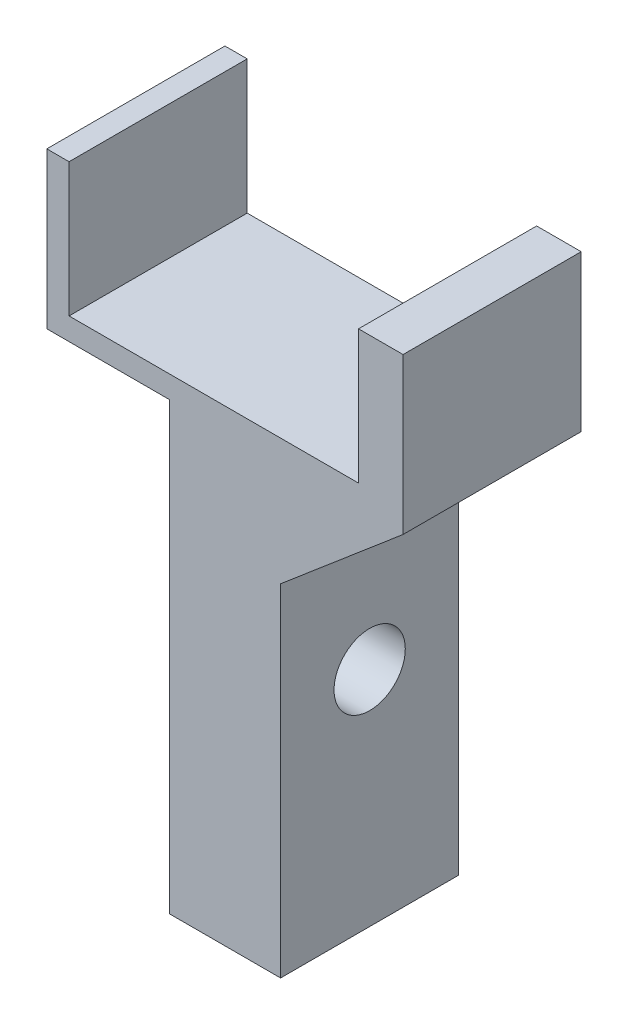
ISO-10303-21;
HEADER;
FILE_DESCRIPTION(('STEP AP214'),'2;1');
FILE_NAME('part.step','',(''),(''),'','','');
FILE_SCHEMA(('AUTOMOTIVE_DESIGN { 1 0 10303 214 1 1 1 1 }'));
ENDSEC;
DATA;
#1=APPLICATION_CONTEXT('core data for automotive mechanical design processes');
#2=APPLICATION_PROTOCOL_DEFINITION('international standard','automotive_design',2000,#1);
#3=PRODUCT_CONTEXT('',#1,'mechanical');
#4=PRODUCT('Part','Part','',(#3));
#5=PRODUCT_RELATED_PRODUCT_CATEGORY('part','',(#4));
#6=PRODUCT_DEFINITION_FORMATION('','',#4);
#7=PRODUCT_DEFINITION_CONTEXT('part definition',#1,'design');
#8=PRODUCT_DEFINITION('design','',#6,#7);
#9=PRODUCT_DEFINITION_SHAPE('','',#8);
#10=(LENGTH_UNIT() NAMED_UNIT(*) SI_UNIT(.MILLI.,.METRE.));
#11=(NAMED_UNIT(*) PLANE_ANGLE_UNIT() SI_UNIT($,.RADIAN.));
#12=(NAMED_UNIT(*) SI_UNIT($,.STERADIAN.) SOLID_ANGLE_UNIT());
#13=UNCERTAINTY_MEASURE_WITH_UNIT(LENGTH_MEASURE(1.E-05),#10,'distance_accuracy_value','');
#14=(GEOMETRIC_REPRESENTATION_CONTEXT(3) GLOBAL_UNCERTAINTY_ASSIGNED_CONTEXT((#13)) GLOBAL_UNIT_ASSIGNED_CONTEXT((#10,
#11,#12)) REPRESENTATION_CONTEXT('',''));
#15=CARTESIAN_POINT('',(0.,0.,0.));
#16=DIRECTION('',(0.,0.,1.));
#17=DIRECTION('',(1.,0.,0.));
#18=AXIS2_PLACEMENT_3D('',#15,#16,#17);
#19=CARTESIAN_POINT('',(5.5,27.,8.));
#20=DIRECTION('',(0.,-1.,0.));
#21=DIRECTION('',(1.,0.,0.));
#22=AXIS2_PLACEMENT_3D('',#19,#20,#21);
#23=PLANE('',#22);
#24=DIRECTION('',(-1.,0.,0.));
#25=VECTOR('',#24,1.);
#26=CARTESIAN_POINT('',(5.5,27.,0.));
#27=LINE('',#26,#25);
#28=CARTESIAN_POINT('',(5.5,27.,0.));
#29=VERTEX_POINT('',#28);
#30=CARTESIAN_POINT('',(3.5,27.,0.));
#31=VERTEX_POINT('',#30);
#32=EDGE_CURVE('E155',#29,#31,#27,.T.);
#33=ORIENTED_EDGE('',*,*,#32,.T.);
#34=DIRECTION('',(0.,0.,1.));
#35=VECTOR('',#34,1.);
#36=CARTESIAN_POINT('',(3.5,27.,8.));
#37=LINE('',#36,#35);
#38=CARTESIAN_POINT('',(3.5,27.,8.));
#39=VERTEX_POINT('',#38);
#40=EDGE_CURVE('E150',#31,#39,#37,.T.);
#41=ORIENTED_EDGE('',*,*,#40,.T.);
#42=DIRECTION('',(-1.,0.,0.));
#43=VECTOR('',#42,1.);
#44=CARTESIAN_POINT('',(5.5,27.,8.));
#45=LINE('',#44,#43);
#46=CARTESIAN_POINT('',(5.5,27.,8.));
#47=VERTEX_POINT('',#46);
#48=EDGE_CURVE('E196',#47,#39,#45,.T.);
#49=ORIENTED_EDGE('',*,*,#48,.F.);
#50=DIRECTION('',(0.,0.,-1.));
#51=VECTOR('',#50,1.);
#52=CARTESIAN_POINT('',(5.5,27.,8.));
#53=LINE('',#52,#51);
#54=EDGE_CURVE('E171',#47,#29,#53,.T.);
#55=ORIENTED_EDGE('',*,*,#54,.T.);
#56=EDGE_LOOP('',(#33,#41,#49,#55));
#57=FACE_BOUND('',#56,.T.);
#58=ADVANCED_FACE('F35',(#57),#23,.F.);
#59=CARTESIAN_POINT('',(0.,0.,8.));
#60=DIRECTION('',(-1.,0.,0.));
#61=DIRECTION('',(0.,0.,1.));
#62=AXIS2_PLACEMENT_3D('',#59,#60,#61);
#63=PLANE('',#62);
#64=CARTESIAN_POINT('',(0.,10.,4.));
#65=DIRECTION('',(1.,0.,0.));
#66=DIRECTION('',(0.,0.,-1.));
#67=AXIS2_PLACEMENT_3D('',#64,#65,#66);
#68=CIRCLE('',#67,1.6);
#69=CARTESIAN_POINT('',(0.,10.,2.4));
#70=VERTEX_POINT('',#69);
#71=EDGE_CURVE('E226',#70,#70,#68,.T.);
#72=ORIENTED_EDGE('',*,*,#71,.F.);
#73=EDGE_LOOP('',(#72));
#74=FACE_BOUND('',#73,.T.);
#75=DIRECTION('',(0.,1.,0.));
#76=VECTOR('',#75,1.);
#77=CARTESIAN_POINT('',(0.,0.,0.));
#78=LINE('',#77,#76);
#79=CARTESIAN_POINT('',(0.,0.,0.));
#80=VERTEX_POINT('',#79);
#81=CARTESIAN_POINT('',(0.,15.3335945399065,0.));
#82=VERTEX_POINT('',#81);
#83=EDGE_CURVE('E146',#80,#82,#78,.T.);
#84=ORIENTED_EDGE('',*,*,#83,.T.);
#85=DIRECTION('',(0.,0.,-1.));
#86=VECTOR('',#85,1.);
#87=CARTESIAN_POINT('',(0.,15.3335945399065,8.));
#88=LINE('',#87,#86);
#89=CARTESIAN_POINT('',(0.,15.3335945399065,8.));
#90=VERTEX_POINT('',#89);
#91=EDGE_CURVE('E44',#90,#82,#88,.T.);
#92=ORIENTED_EDGE('',*,*,#91,.F.);
#93=DIRECTION('',(0.,1.,0.));
#94=VECTOR('',#93,1.);
#95=CARTESIAN_POINT('',(0.,0.,8.));
#96=LINE('',#95,#94);
#97=CARTESIAN_POINT('',(0.,0.,8.));
#98=VERTEX_POINT('',#97);
#99=EDGE_CURVE('E164',#98,#90,#96,.T.);
#100=ORIENTED_EDGE('',*,*,#99,.F.);
#101=DIRECTION('',(0.,0.,-1.));
#102=VECTOR('',#101,1.);
#103=CARTESIAN_POINT('',(0.,0.,8.));
#104=LINE('',#103,#102);
#105=EDGE_CURVE('E142',#98,#80,#104,.T.);
#106=ORIENTED_EDGE('',*,*,#105,.T.);
#107=EDGE_LOOP('',(#84,#92,#100,#106));
#108=FACE_BOUND('',#107,.T.);
#109=ADVANCED_FACE('F37',(#74,#108),#63,.F.);
#110=CARTESIAN_POINT('',(5.5,20.,8.));
#111=DIRECTION('',(-0.646956392391137,0.762527000403425,0.));
#112=DIRECTION('',(-0.762527000403426,-0.646956392391137,0.));
#113=AXIS2_PLACEMENT_3D('',#110,#111,#112);
#114=PLANE('',#113);
#115=DIRECTION('',(0.762527000403425,0.646956392391137,0.));
#116=VECTOR('',#115,1.);
#117=CARTESIAN_POINT('',(5.5,20.,0.));
#118=LINE('',#117,#116);
#119=CARTESIAN_POINT('',(5.5,20.,0.));
#120=VERTEX_POINT('',#119);
#121=EDGE_CURVE('E149',#82,#120,#118,.T.);
#122=ORIENTED_EDGE('',*,*,#121,.T.);
#123=DIRECTION('',(0.,0.,-1.));
#124=VECTOR('',#123,1.);
#125=CARTESIAN_POINT('',(5.5,20.,8.));
#126=LINE('',#125,#124);
#127=CARTESIAN_POINT('',(5.5,20.,8.));
#128=VERTEX_POINT('',#127);
#129=EDGE_CURVE('E174',#128,#120,#126,.T.);
#130=ORIENTED_EDGE('',*,*,#129,.F.);
#131=DIRECTION('',(0.762527000403425,0.646956392391137,0.));
#132=VECTOR('',#131,1.);
#133=CARTESIAN_POINT('',(5.5,20.,8.));
#134=LINE('',#133,#132);
#135=EDGE_CURVE('E102',#90,#128,#134,.T.);
#136=ORIENTED_EDGE('',*,*,#135,.F.);
#137=ORIENTED_EDGE('',*,*,#91,.T.);
#138=EDGE_LOOP('',(#122,#130,#136,#137));
#139=FACE_BOUND('',#138,.T.);
#140=ADVANCED_FACE('F178',(#139),#114,.F.);
#141=CARTESIAN_POINT('',(5.5,27.,8.));
#142=DIRECTION('',(-1.,0.,0.));
#143=DIRECTION('',(0.,-1.,0.));
#144=AXIS2_PLACEMENT_3D('',#141,#142,#143);
#145=PLANE('',#144);
#146=DIRECTION('',(0.,1.,0.));
#147=VECTOR('',#146,1.);
#148=CARTESIAN_POINT('',(5.5,27.,0.));
#149=LINE('',#148,#147);
#150=EDGE_CURVE('E152',#120,#29,#149,.T.);
#151=ORIENTED_EDGE('',*,*,#150,.T.);
#152=ORIENTED_EDGE('',*,*,#54,.F.);
#153=DIRECTION('',(0.,1.,0.));
#154=VECTOR('',#153,1.);
#155=CARTESIAN_POINT('',(5.5,27.,8.));
#156=LINE('',#155,#154);
#157=EDGE_CURVE('E200',#128,#47,#156,.T.);
#158=ORIENTED_EDGE('',*,*,#157,.F.);
#159=ORIENTED_EDGE('',*,*,#129,.T.);
#160=EDGE_LOOP('',(#151,#152,#158,#159));
#161=FACE_BOUND('',#160,.T.);
#162=ADVANCED_FACE('F189',(#161),#145,.F.);
#163=CARTESIAN_POINT('',(-9.5,27.,8.));
#164=VERTEX_POINT('',#163);
#165=CARTESIAN_POINT('',(-10.5,27.,8.));
#166=VERTEX_POINT('',#165);
#167=EDGE_CURVE('E198',#164,#166,#45,.T.);
#168=ORIENTED_EDGE('',*,*,#167,.F.);
#169=DIRECTION('',(0.,0.,-1.));
#170=VECTOR('',#169,1.);
#171=CARTESIAN_POINT('',(-9.5,27.,8.));
#172=LINE('',#171,#170);
#173=CARTESIAN_POINT('',(-9.5,27.,0.));
#174=VERTEX_POINT('',#173);
#175=EDGE_CURVE('E206',#164,#174,#172,.T.);
#176=ORIENTED_EDGE('',*,*,#175,.T.);
#177=CARTESIAN_POINT('',(-10.5,27.,0.));
#178=VERTEX_POINT('',#177);
#179=EDGE_CURVE('E154',#174,#178,#27,.T.);
#180=ORIENTED_EDGE('',*,*,#179,.T.);
#181=DIRECTION('',(0.,0.,-1.));
#182=VECTOR('',#181,1.);
#183=CARTESIAN_POINT('',(-10.5,27.,8.));
#184=LINE('',#183,#182);
#185=EDGE_CURVE('E168',#166,#178,#184,.T.);
#186=ORIENTED_EDGE('',*,*,#185,.F.);
#187=EDGE_LOOP('',(#168,#176,#180,#186));
#188=FACE_BOUND('',#187,.T.);
#189=ADVANCED_FACE('F246',(#188),#23,.F.);
#190=CARTESIAN_POINT('',(-10.5,27.,8.));
#191=DIRECTION('',(1.,0.,0.));
#192=DIRECTION('',(0.,0.,-1.));
#193=AXIS2_PLACEMENT_3D('',#190,#191,#192);
#194=PLANE('',#193);
#195=DIRECTION('',(0.,-1.,0.));
#196=VECTOR('',#195,1.);
#197=CARTESIAN_POINT('',(-10.5,27.,0.));
#198=LINE('',#197,#196);
#199=CARTESIAN_POINT('',(-10.5,20.,0.));
#200=VERTEX_POINT('',#199);
#201=EDGE_CURVE('E158',#178,#200,#198,.T.);
#202=ORIENTED_EDGE('',*,*,#201,.T.);
#203=DIRECTION('',(0.,0.,-1.));
#204=VECTOR('',#203,1.);
#205=CARTESIAN_POINT('',(-10.5,20.,8.));
#206=LINE('',#205,#204);
#207=CARTESIAN_POINT('',(-10.5,20.,8.));
#208=VERTEX_POINT('',#207);
#209=EDGE_CURVE('E137',#208,#200,#206,.T.);
#210=ORIENTED_EDGE('',*,*,#209,.F.);
#211=DIRECTION('',(0.,-1.,0.));
#212=VECTOR('',#211,1.);
#213=CARTESIAN_POINT('',(-10.5,27.,8.));
#214=LINE('',#213,#212);
#215=EDGE_CURVE('E125',#166,#208,#214,.T.);
#216=ORIENTED_EDGE('',*,*,#215,.F.);
#217=ORIENTED_EDGE('',*,*,#185,.T.);
#218=EDGE_LOOP('',(#202,#210,#216,#217));
#219=FACE_BOUND('',#218,.T.);
#220=ADVANCED_FACE('F254',(#219),#194,.F.);
#221=CARTESIAN_POINT('',(-5.,20.,8.));
#222=DIRECTION('',(0.,1.,0.));
#223=DIRECTION('',(0.,0.,1.));
#224=AXIS2_PLACEMENT_3D('',#221,#222,#223);
#225=PLANE('',#224);
#226=DIRECTION('',(1.,0.,0.));
#227=VECTOR('',#226,1.);
#228=CARTESIAN_POINT('',(-5.,20.,0.));
#229=LINE('',#228,#227);
#230=CARTESIAN_POINT('',(-5.,20.,0.));
#231=VERTEX_POINT('',#230);
#232=EDGE_CURVE('E134',#200,#231,#229,.T.);
#233=ORIENTED_EDGE('',*,*,#232,.T.);
#234=DIRECTION('',(0.,0.,-1.));
#235=VECTOR('',#234,1.);
#236=CARTESIAN_POINT('',(-5.,20.,8.));
#237=LINE('',#236,#235);
#238=CARTESIAN_POINT('',(-5.,20.,8.));
#239=VERTEX_POINT('',#238);
#240=EDGE_CURVE('E131',#239,#231,#237,.T.);
#241=ORIENTED_EDGE('',*,*,#240,.F.);
#242=DIRECTION('',(1.,0.,0.));
#243=VECTOR('',#242,1.);
#244=CARTESIAN_POINT('',(-5.,20.,8.));
#245=LINE('',#244,#243);
#246=EDGE_CURVE('E117',#208,#239,#245,.T.);
#247=ORIENTED_EDGE('',*,*,#246,.F.);
#248=ORIENTED_EDGE('',*,*,#209,.T.);
#249=EDGE_LOOP('',(#233,#241,#247,#248));
#250=FACE_BOUND('',#249,.T.);
#251=ADVANCED_FACE('F132',(#250),#225,.F.);
#252=CARTESIAN_POINT('',(-5.,0.,8.));
#253=DIRECTION('',(1.,0.,0.));
#254=DIRECTION('',(0.,0.,-1.));
#255=AXIS2_PLACEMENT_3D('',#252,#253,#254);
#256=PLANE('',#255);
#257=CARTESIAN_POINT('',(-5.,10.,4.));
#258=DIRECTION('',(1.,0.,0.));
#259=DIRECTION('',(0.,0.,-1.));
#260=AXIS2_PLACEMENT_3D('',#257,#258,#259);
#261=CIRCLE('',#260,1.6);
#262=CARTESIAN_POINT('',(-5.,10.,2.4));
#263=VERTEX_POINT('',#262);
#264=EDGE_CURVE('E39',#263,#263,#261,.T.);
#265=ORIENTED_EDGE('',*,*,#264,.T.);
#266=EDGE_LOOP('',(#265));
#267=FACE_BOUND('',#266,.T.);
#268=DIRECTION('',(0.,-1.,0.));
#269=VECTOR('',#268,1.);
#270=CARTESIAN_POINT('',(-5.,0.,0.));
#271=LINE('',#270,#269);
#272=CARTESIAN_POINT('',(-5.,0.,0.));
#273=VERTEX_POINT('',#272);
#274=EDGE_CURVE('E161',#231,#273,#271,.T.);
#275=ORIENTED_EDGE('',*,*,#274,.T.);
#276=DIRECTION('',(0.,0.,-1.));
#277=VECTOR('',#276,1.);
#278=CARTESIAN_POINT('',(-5.,0.,8.));
#279=LINE('',#278,#277);
#280=CARTESIAN_POINT('',(-5.,0.,8.));
#281=VERTEX_POINT('',#280);
#282=EDGE_CURVE('E138',#281,#273,#279,.T.);
#283=ORIENTED_EDGE('',*,*,#282,.F.);
#284=DIRECTION('',(0.,-1.,0.));
#285=VECTOR('',#284,1.);
#286=CARTESIAN_POINT('',(-5.,0.,8.));
#287=LINE('',#286,#285);
#288=EDGE_CURVE('E122',#239,#281,#287,.T.);
#289=ORIENTED_EDGE('',*,*,#288,.F.);
#290=ORIENTED_EDGE('',*,*,#240,.T.);
#291=EDGE_LOOP('',(#275,#283,#289,#290));
#292=FACE_BOUND('',#291,.T.);
#293=ADVANCED_FACE('F140',(#267,#292),#256,.F.);
#294=CARTESIAN_POINT('',(0.,0.,8.));
#295=DIRECTION('',(0.,1.,0.));
#296=DIRECTION('',(0.,0.,1.));
#297=AXIS2_PLACEMENT_3D('',#294,#295,#296);
#298=PLANE('',#297);
#299=DIRECTION('',(1.,0.,0.));
#300=VECTOR('',#299,1.);
#301=CARTESIAN_POINT('',(0.,0.,0.));
#302=LINE('',#301,#300);
#303=EDGE_CURVE('E93',#273,#80,#302,.T.);
#304=ORIENTED_EDGE('',*,*,#303,.T.);
#305=ORIENTED_EDGE('',*,*,#105,.F.);
#306=DIRECTION('',(1.,0.,0.));
#307=VECTOR('',#306,1.);
#308=CARTESIAN_POINT('',(0.,0.,8.));
#309=LINE('',#308,#307);
#310=EDGE_CURVE('E60',#281,#98,#309,.T.);
#311=ORIENTED_EDGE('',*,*,#310,.F.);
#312=ORIENTED_EDGE('',*,*,#282,.T.);
#313=EDGE_LOOP('',(#304,#305,#311,#312));
#314=FACE_BOUND('',#313,.T.);
#315=ADVANCED_FACE('F283',(#314),#298,.F.);
#316=CARTESIAN_POINT('',(0.,0.,8.));
#317=DIRECTION('',(0.,0.,1.));
#318=DIRECTION('',(1.,0.,0.));
#319=AXIS2_PLACEMENT_3D('',#316,#317,#318);
#320=PLANE('',#319);
#321=DIRECTION('',(0.,-1.,0.));
#322=VECTOR('',#321,1.);
#323=CARTESIAN_POINT('',(3.5,27.4991061658523,8.));
#324=LINE('',#323,#322);
#325=CARTESIAN_POINT('',(3.5,21.,8.));
#326=VERTEX_POINT('',#325);
#327=EDGE_CURVE('E217',#39,#326,#324,.T.);
#328=ORIENTED_EDGE('',*,*,#327,.T.);
#329=DIRECTION('',(-1.,0.,0.));
#330=VECTOR('',#329,1.);
#331=CARTESIAN_POINT('',(3.5,21.,8.));
#332=LINE('',#331,#330);
#333=CARTESIAN_POINT('',(-9.5,21.,8.));
#334=VERTEX_POINT('',#333);
#335=EDGE_CURVE('E222',#326,#334,#332,.T.);
#336=ORIENTED_EDGE('',*,*,#335,.T.);
#337=DIRECTION('',(0.,1.,0.));
#338=VECTOR('',#337,1.);
#339=CARTESIAN_POINT('',(-9.5,27.4991061658523,8.));
#340=LINE('',#339,#338);
#341=EDGE_CURVE('E211',#334,#164,#340,.T.);
#342=ORIENTED_EDGE('',*,*,#341,.T.);
#343=ORIENTED_EDGE('',*,*,#167,.T.);
#344=ORIENTED_EDGE('',*,*,#215,.T.);
#345=ORIENTED_EDGE('',*,*,#246,.T.);
#346=ORIENTED_EDGE('',*,*,#288,.T.);
#347=ORIENTED_EDGE('',*,*,#310,.T.);
#348=ORIENTED_EDGE('',*,*,#99,.T.);
#349=ORIENTED_EDGE('',*,*,#135,.T.);
#350=ORIENTED_EDGE('',*,*,#157,.T.);
#351=ORIENTED_EDGE('',*,*,#48,.T.);
#352=EDGE_LOOP('',(#328,#336,#342,#343,#344,#345,#346,#347,#348,#349,#350,#351));
#353=FACE_BOUND('',#352,.T.);
#354=ADVANCED_FACE('F120',(#353),#320,.T.);
#355=CARTESIAN_POINT('',(0.,0.,0.));
#356=DIRECTION('',(0.,0.,1.));
#357=DIRECTION('',(1.,0.,0.));
#358=AXIS2_PLACEMENT_3D('',#355,#356,#357);
#359=PLANE('',#358);
#360=DIRECTION('',(-1.,0.,0.));
#361=VECTOR('',#360,1.);
#362=CARTESIAN_POINT('',(3.5,21.,0.));
#363=LINE('',#362,#361);
#364=CARTESIAN_POINT('',(3.5,21.,0.));
#365=VERTEX_POINT('',#364);
#366=CARTESIAN_POINT('',(-9.5,21.,0.));
#367=VERTEX_POINT('',#366);
#368=EDGE_CURVE('E218',#365,#367,#363,.T.);
#369=ORIENTED_EDGE('',*,*,#368,.F.);
#370=DIRECTION('',(0.,1.,0.));
#371=VECTOR('',#370,1.);
#372=CARTESIAN_POINT('',(3.5,0.,0.));
#373=LINE('',#372,#371);
#374=EDGE_CURVE('E11',#365,#31,#373,.T.);
#375=ORIENTED_EDGE('',*,*,#374,.T.);
#376=ORIENTED_EDGE('',*,*,#32,.F.);
#377=ORIENTED_EDGE('',*,*,#150,.F.);
#378=ORIENTED_EDGE('',*,*,#121,.F.);
#379=ORIENTED_EDGE('',*,*,#83,.F.);
#380=ORIENTED_EDGE('',*,*,#303,.F.);
#381=ORIENTED_EDGE('',*,*,#274,.F.);
#382=ORIENTED_EDGE('',*,*,#232,.F.);
#383=ORIENTED_EDGE('',*,*,#201,.F.);
#384=ORIENTED_EDGE('',*,*,#179,.F.);
#385=DIRECTION('',(0.,1.,0.));
#386=VECTOR('',#385,1.);
#387=CARTESIAN_POINT('',(-9.5,27.4991061658523,0.));
#388=LINE('',#387,#386);
#389=EDGE_CURVE('E214',#367,#174,#388,.T.);
#390=ORIENTED_EDGE('',*,*,#389,.F.);
#391=EDGE_LOOP('',(#369,#375,#376,#377,#378,#379,#380,#381,#382,#383,#384,#390));
#392=FACE_BOUND('',#391,.T.);
#393=ADVANCED_FACE('F184',(#392),#359,.F.);
#394=CARTESIAN_POINT('',(3.5,27.4991061658523,8.));
#395=DIRECTION('',(1.,0.,0.));
#396=DIRECTION('',(0.,1.,0.));
#397=AXIS2_PLACEMENT_3D('',#394,#395,#396);
#398=PLANE('',#397);
#399=ORIENTED_EDGE('',*,*,#374,.F.);
#400=DIRECTION('',(0.,0.,-1.));
#401=VECTOR('',#400,1.);
#402=CARTESIAN_POINT('',(3.5,21.,8.));
#403=LINE('',#402,#401);
#404=EDGE_CURVE('E51',#326,#365,#403,.T.);
#405=ORIENTED_EDGE('',*,*,#404,.F.);
#406=ORIENTED_EDGE('',*,*,#327,.F.);
#407=ORIENTED_EDGE('',*,*,#40,.F.);
#408=EDGE_LOOP('',(#399,#405,#406,#407));
#409=FACE_BOUND('',#408,.T.);
#410=ADVANCED_FACE('F280',(#409),#398,.F.);
#411=CARTESIAN_POINT('',(-9.5,27.4991061658523,8.));
#412=DIRECTION('',(-1.,0.,0.));
#413=DIRECTION('',(0.,0.,1.));
#414=AXIS2_PLACEMENT_3D('',#411,#412,#413);
#415=PLANE('',#414);
#416=ORIENTED_EDGE('',*,*,#341,.F.);
#417=DIRECTION('',(0.,0.,-1.));
#418=VECTOR('',#417,1.);
#419=CARTESIAN_POINT('',(-9.5,21.,8.));
#420=LINE('',#419,#418);
#421=EDGE_CURVE('E209',#334,#367,#420,.T.);
#422=ORIENTED_EDGE('',*,*,#421,.T.);
#423=ORIENTED_EDGE('',*,*,#389,.T.);
#424=ORIENTED_EDGE('',*,*,#175,.F.);
#425=EDGE_LOOP('',(#416,#422,#423,#424));
#426=FACE_BOUND('',#425,.T.);
#427=ADVANCED_FACE('F241',(#426),#415,.F.);
#428=CARTESIAN_POINT('',(3.5,21.,8.));
#429=DIRECTION('',(0.,-1.,0.));
#430=DIRECTION('',(0.,0.,-1.));
#431=AXIS2_PLACEMENT_3D('',#428,#429,#430);
#432=PLANE('',#431);
#433=ORIENTED_EDGE('',*,*,#368,.T.);
#434=ORIENTED_EDGE('',*,*,#421,.F.);
#435=ORIENTED_EDGE('',*,*,#335,.F.);
#436=ORIENTED_EDGE('',*,*,#404,.T.);
#437=EDGE_LOOP('',(#433,#434,#435,#436));
#438=FACE_BOUND('',#437,.T.);
#439=ADVANCED_FACE('F236',(#438),#432,.F.);
#440=CARTESIAN_POINT('',(-10.5,10.,4.));
#441=DIRECTION('',(1.,0.,0.));
#442=DIRECTION('',(0.,0.,-1.));
#443=AXIS2_PLACEMENT_3D('',#440,#441,#442);
#444=CYLINDRICAL_SURFACE('',#443,1.6);
#445=CARTESIAN_POINT('',(0.,10.,2.4));
#446=CARTESIAN_POINT('',(-0.0520833333333334,10.,2.4));
#447=CARTESIAN_POINT('',(-0.104166666666667,10.,2.4));
#448=CARTESIAN_POINT('',(-0.208333333333334,10.,2.4));
#449=CARTESIAN_POINT('',(-0.260416666666667,10.,2.4));
#450=CARTESIAN_POINT('',(-0.364583333333334,10.,2.4));
#451=CARTESIAN_POINT('',(-0.416666666666667,10.,2.4));
#452=CARTESIAN_POINT('',(-0.520833333333334,10.,2.4));
#453=CARTESIAN_POINT('',(-0.572916666666667,10.,2.4));
#454=CARTESIAN_POINT('',(-0.677083333333334,10.,2.4));
#455=CARTESIAN_POINT('',(-0.729166666666667,10.,2.4));
#456=CARTESIAN_POINT('',(-0.833333333333334,10.,2.4));
#457=CARTESIAN_POINT('',(-0.885416666666668,10.,2.4));
#458=CARTESIAN_POINT('',(-0.989583333333334,10.,2.4));
#459=CARTESIAN_POINT('',(-1.04166666666667,10.,2.4));
#460=CARTESIAN_POINT('',(-1.14583333333333,10.,2.4));
#461=CARTESIAN_POINT('',(-1.19791666666667,10.,2.4));
#462=CARTESIAN_POINT('',(-1.30208333333333,10.,2.4));
#463=CARTESIAN_POINT('',(-1.35416666666667,10.,2.4));
#464=CARTESIAN_POINT('',(-1.45833333333333,10.,2.4));
#465=CARTESIAN_POINT('',(-1.51041666666667,10.,2.4));
#466=CARTESIAN_POINT('',(-1.61458333333333,10.,2.4));
#467=CARTESIAN_POINT('',(-1.66666666666667,10.,2.4));
#468=CARTESIAN_POINT('',(-1.77083333333334,10.,2.4));
#469=CARTESIAN_POINT('',(-1.82291666666667,10.,2.4));
#470=CARTESIAN_POINT('',(-1.92708333333334,10.,2.4));
#471=CARTESIAN_POINT('',(-1.97916666666667,10.,2.4));
#472=CARTESIAN_POINT('',(-2.08333333333334,10.,2.4));
#473=CARTESIAN_POINT('',(-2.13541666666667,10.,2.4));
#474=CARTESIAN_POINT('',(-2.23958333333334,10.,2.4));
#475=CARTESIAN_POINT('',(-2.29166666666667,10.,2.4));
#476=CARTESIAN_POINT('',(-2.39583333333334,10.,2.4));
#477=CARTESIAN_POINT('',(-2.44791666666667,10.,2.4));
#478=CARTESIAN_POINT('',(-2.55208333333334,10.,2.4));
#479=CARTESIAN_POINT('',(-2.60416666666667,10.,2.4));
#480=CARTESIAN_POINT('',(-2.70833333333334,10.,2.4));
#481=CARTESIAN_POINT('',(-2.76041666666667,10.,2.4));
#482=CARTESIAN_POINT('',(-2.86458333333333,10.,2.4));
#483=CARTESIAN_POINT('',(-2.91666666666667,10.,2.4));
#484=CARTESIAN_POINT('',(-3.02083333333333,10.,2.4));
#485=CARTESIAN_POINT('',(-3.07291666666667,10.,2.4));
#486=CARTESIAN_POINT('',(-3.17708333333333,10.,2.4));
#487=CARTESIAN_POINT('',(-3.22916666666667,10.,2.4));
#488=CARTESIAN_POINT('',(-3.33333333333333,10.,2.4));
#489=CARTESIAN_POINT('',(-3.38541666666667,10.,2.4));
#490=CARTESIAN_POINT('',(-3.48958333333333,10.,2.4));
#491=CARTESIAN_POINT('',(-3.54166666666667,10.,2.4));
#492=CARTESIAN_POINT('',(-3.64583333333333,10.,2.4));
#493=CARTESIAN_POINT('',(-3.69791666666667,10.,2.4));
#494=CARTESIAN_POINT('',(-3.80208333333333,10.,2.4));
#495=CARTESIAN_POINT('',(-3.85416666666667,10.,2.4));
#496=CARTESIAN_POINT('',(-3.95833333333333,10.,2.4));
#497=CARTESIAN_POINT('',(-4.01041666666667,10.,2.4));
#498=CARTESIAN_POINT('',(-4.11458333333333,10.,2.4));
#499=CARTESIAN_POINT('',(-4.16666666666667,10.,2.4));
#500=CARTESIAN_POINT('',(-4.27083333333333,10.,2.4));
#501=CARTESIAN_POINT('',(-4.32291666666667,10.,2.4));
#502=CARTESIAN_POINT('',(-4.42708333333333,10.,2.4));
#503=CARTESIAN_POINT('',(-4.47916666666667,10.,2.4));
#504=CARTESIAN_POINT('',(-4.58333333333333,10.,2.4));
#505=CARTESIAN_POINT('',(-4.63541666666667,10.,2.4));
#506=CARTESIAN_POINT('',(-4.73958333333333,10.,2.4));
#507=CARTESIAN_POINT('',(-4.79166666666667,10.,2.4));
#508=CARTESIAN_POINT('',(-4.89583333333334,10.,2.4));
#509=CARTESIAN_POINT('',(-4.94791666666667,10.,2.4));
#510=CARTESIAN_POINT('',(-5.,10.,2.4));
#511=B_SPLINE_CURVE_WITH_KNOTS('',3,(#445,#446,#447,#448,#449,#450,#451,#452,#453,#454,#455,
#456,#457,#458,#459,#460,#461,#462,#463,#464,#465,#466,#467,#468,#469,#470,#471,#472,#473,#474,
#475,#476,#477,#478,#479,#480,#481,#482,#483,#484,#485,#486,#487,#488,#489,#490,#491,#492,#493,
#494,#495,#496,#497,#498,#499,#500,#501,#502,#503,#504,#505,#506,#507,#508,#509,#510),
.UNSPECIFIED.,.F.,.F.,(4,2,2,2,2,2,2,2,2,2,2,2,2,2,2,2,2,2,2,2,2,2,2,2,2,2,2,2,2,2,2,2,4),(0.,
0.15625,0.3125,0.46875,0.625000000000001,0.781250000000001,0.937500000000001,1.09375,1.25,
1.40625,1.5625,1.71875,1.875,2.03125,2.1875,2.34375,2.5,2.65625,2.8125,2.96875,3.125,3.28125,
3.4375,3.59375,3.75,3.90625,4.0625,4.21875,4.375,4.53125,4.6875,4.84375,5.),.UNSPECIFIED.);
#512=EDGE_CURVE('BSEAM234',#70,#263,#511,.T.);
#513=ORIENTED_EDGE('',*,*,#71,.T.);
#514=ORIENTED_EDGE('',*,*,#264,.F.);
#515=ORIENTED_EDGE('',*,*,#512,.T.);
#516=ORIENTED_EDGE('',*,*,#512,.F.);
#517=EDGE_LOOP('',(#513,#515,#514,#516));
#518=FACE_BOUND('',#517,.T.);
#519=ADVANCED_FACE('F234',(#518),#444,.F.);
#520=CLOSED_SHELL('',(#58,#109,#140,#162,#189,#220,#251,#293,#315,#354,#393,#410,#427,#439,#519));
#521=MANIFOLD_SOLID_BREP('B2',#520);
#522=ADVANCED_BREP_SHAPE_REPRESENTATION('',(#18,#521),#14);
#523=SHAPE_DEFINITION_REPRESENTATION(#9,#522);
ENDSEC;
END-ISO-10303-21;
